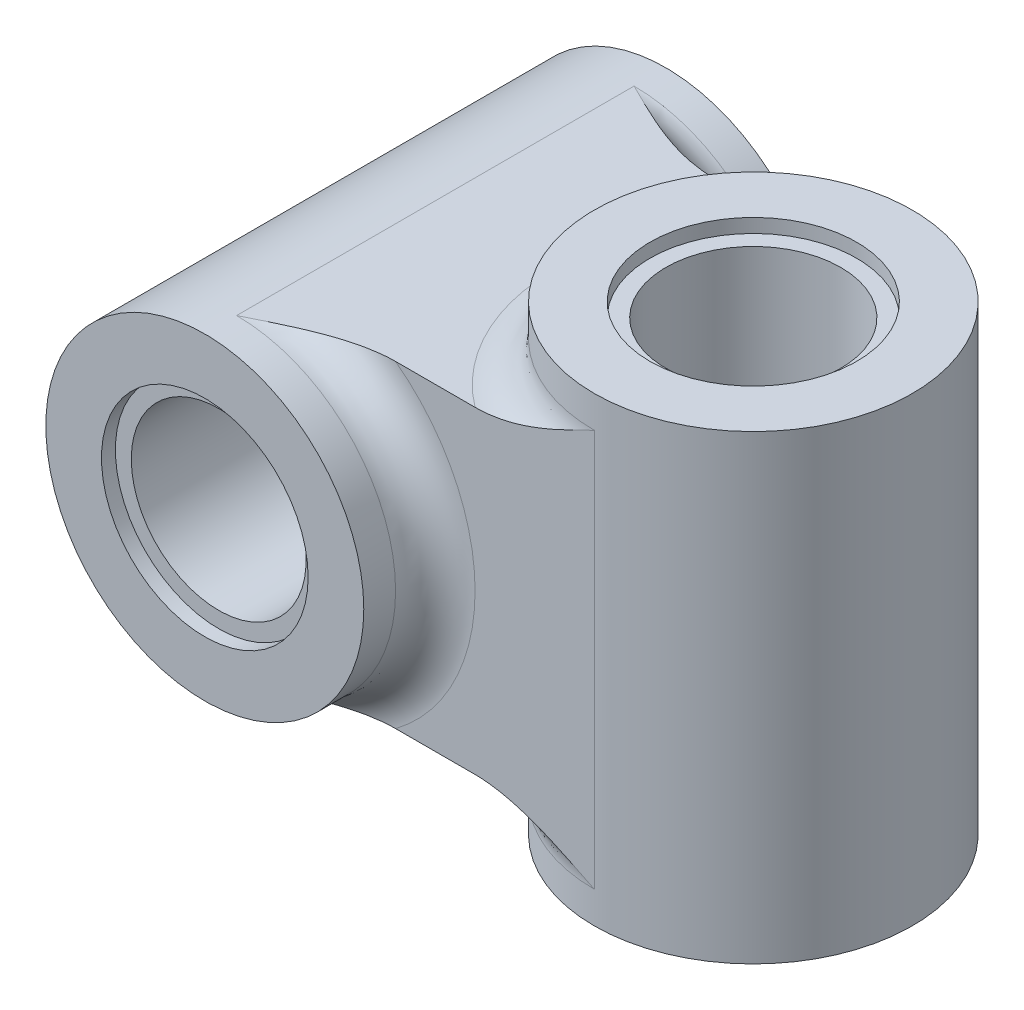
ISO-10303-21;
HEADER;
FILE_DESCRIPTION(('STEP AP214'),'2;1');
FILE_NAME('part.step','',(''),(''),'','','');
FILE_SCHEMA(('AUTOMOTIVE_DESIGN { 1 0 10303 214 1 1 1 1 }'));
ENDSEC;
DATA;
#1=APPLICATION_CONTEXT('core data for automotive mechanical design processes');
#2=APPLICATION_PROTOCOL_DEFINITION('international standard','automotive_design',2000,#1);
#3=PRODUCT_CONTEXT('',#1,'mechanical');
#4=PRODUCT('Part','Part','',(#3));
#5=PRODUCT_RELATED_PRODUCT_CATEGORY('part','',(#4));
#6=PRODUCT_DEFINITION_FORMATION('','',#4);
#7=PRODUCT_DEFINITION_CONTEXT('part definition',#1,'design');
#8=PRODUCT_DEFINITION('design','',#6,#7);
#9=PRODUCT_DEFINITION_SHAPE('','',#8);
#10=(LENGTH_UNIT() NAMED_UNIT(*) SI_UNIT(.MILLI.,.METRE.));
#11=(NAMED_UNIT(*) PLANE_ANGLE_UNIT() SI_UNIT($,.RADIAN.));
#12=(NAMED_UNIT(*) SI_UNIT($,.STERADIAN.) SOLID_ANGLE_UNIT());
#13=UNCERTAINTY_MEASURE_WITH_UNIT(LENGTH_MEASURE(1.E-05),#10,'distance_accuracy_value','');
#14=(GEOMETRIC_REPRESENTATION_CONTEXT(3) GLOBAL_UNCERTAINTY_ASSIGNED_CONTEXT((#13)) GLOBAL_UNIT_ASSIGNED_CONTEXT((#10,
#11,#12)) REPRESENTATION_CONTEXT('',''));
#15=CARTESIAN_POINT('',(0.,0.,0.));
#16=DIRECTION('',(0.,0.,1.));
#17=DIRECTION('',(1.,0.,0.));
#18=AXIS2_PLACEMENT_3D('',#15,#16,#17);
#19=CARTESIAN_POINT('',(40.,29.,29.));
#20=DIRECTION('',(0.,-1.,0.));
#21=DIRECTION('',(0.,0.,-1.));
#22=AXIS2_PLACEMENT_3D('',#19,#20,#21);
#23=CYLINDRICAL_SURFACE('',#22,11.);
#24=CARTESIAN_POINT('',(40.,27.25,29.));
#25=DIRECTION('',(0.,1.,0.));
#26=DIRECTION('',(0.,0.,1.));
#27=AXIS2_PLACEMENT_3D('',#24,#25,#26);
#28=CIRCLE('',#27,11.);
#29=CARTESIAN_POINT('',(40.,27.25,18.));
#30=VERTEX_POINT('',#29);
#31=EDGE_CURVE('E201',#30,#30,#28,.T.);
#32=CARTESIAN_POINT('',(40.,-27.25,29.));
#33=DIRECTION('',(0.,-1.,0.));
#34=DIRECTION('',(0.,0.,-1.));
#35=AXIS2_PLACEMENT_3D('',#32,#33,#34);
#36=CIRCLE('',#35,11.);
#37=CARTESIAN_POINT('',(40.,-27.25,18.));
#38=VERTEX_POINT('',#37);
#39=EDGE_CURVE('E46',#38,#38,#36,.T.);
#40=CARTESIAN_POINT('',(40.,27.25,18.));
#41=CARTESIAN_POINT('',(40.,26.6822916666667,18.));
#42=CARTESIAN_POINT('',(40.,26.1145833333333,18.));
#43=CARTESIAN_POINT('',(40.,24.9791666666667,18.));
#44=CARTESIAN_POINT('',(40.,24.4114583333333,18.));
#45=CARTESIAN_POINT('',(40.,23.2760416666667,18.));
#46=CARTESIAN_POINT('',(40.,22.7083333333333,18.));
#47=CARTESIAN_POINT('',(40.,21.5729166666667,18.));
#48=CARTESIAN_POINT('',(40.,21.0052083333333,18.));
#49=CARTESIAN_POINT('',(40.,19.8697916666667,18.));
#50=CARTESIAN_POINT('',(40.,19.3020833333333,18.));
#51=CARTESIAN_POINT('',(40.,18.1666666666667,18.));
#52=CARTESIAN_POINT('',(40.,17.5989583333333,18.));
#53=CARTESIAN_POINT('',(40.,16.4635416666667,18.));
#54=CARTESIAN_POINT('',(40.,15.8958333333333,18.));
#55=CARTESIAN_POINT('',(40.,14.7604166666667,18.));
#56=CARTESIAN_POINT('',(40.,14.1927083333333,18.));
#57=CARTESIAN_POINT('',(40.,13.0572916666667,18.));
#58=CARTESIAN_POINT('',(40.,12.4895833333333,18.));
#59=CARTESIAN_POINT('',(40.,11.3541666666667,18.));
#60=CARTESIAN_POINT('',(40.,10.7864583333333,18.));
#61=CARTESIAN_POINT('',(40.,9.65104166666667,18.));
#62=CARTESIAN_POINT('',(40.,9.08333333333333,18.));
#63=CARTESIAN_POINT('',(40.,7.94791666666667,18.));
#64=CARTESIAN_POINT('',(40.,7.38020833333333,18.));
#65=CARTESIAN_POINT('',(40.,6.24479166666667,18.));
#66=CARTESIAN_POINT('',(40.,5.67708333333333,18.));
#67=CARTESIAN_POINT('',(40.,4.54166666666667,18.));
#68=CARTESIAN_POINT('',(40.,3.97395833333333,18.));
#69=CARTESIAN_POINT('',(40.,2.83854166666667,18.));
#70=CARTESIAN_POINT('',(40.,2.27083333333333,18.));
#71=CARTESIAN_POINT('',(40.,1.13541666666667,18.));
#72=CARTESIAN_POINT('',(40.,0.567708333333333,18.));
#73=CARTESIAN_POINT('',(40.,-0.567708333333333,18.));
#74=CARTESIAN_POINT('',(40.,-1.13541666666667,18.));
#75=CARTESIAN_POINT('',(40.,-2.27083333333333,18.));
#76=CARTESIAN_POINT('',(40.,-2.83854166666666,18.));
#77=CARTESIAN_POINT('',(40.,-3.97395833333333,18.));
#78=CARTESIAN_POINT('',(40.,-4.54166666666666,18.));
#79=CARTESIAN_POINT('',(40.,-5.67708333333333,18.));
#80=CARTESIAN_POINT('',(40.,-6.24479166666666,18.));
#81=CARTESIAN_POINT('',(40.,-7.38020833333333,18.));
#82=CARTESIAN_POINT('',(40.,-7.94791666666666,18.));
#83=CARTESIAN_POINT('',(40.,-9.08333333333333,18.));
#84=CARTESIAN_POINT('',(40.,-9.65104166666666,18.));
#85=CARTESIAN_POINT('',(40.,-10.7864583333333,18.));
#86=CARTESIAN_POINT('',(40.,-11.3541666666667,18.));
#87=CARTESIAN_POINT('',(40.,-12.4895833333333,18.));
#88=CARTESIAN_POINT('',(40.,-13.0572916666667,18.));
#89=CARTESIAN_POINT('',(40.,-14.1927083333333,18.));
#90=CARTESIAN_POINT('',(40.,-14.7604166666667,18.));
#91=CARTESIAN_POINT('',(40.,-15.8958333333333,18.));
#92=CARTESIAN_POINT('',(40.,-16.4635416666667,18.));
#93=CARTESIAN_POINT('',(40.,-17.5989583333333,18.));
#94=CARTESIAN_POINT('',(40.,-18.1666666666667,18.));
#95=CARTESIAN_POINT('',(40.,-19.3020833333333,18.));
#96=CARTESIAN_POINT('',(40.,-19.8697916666667,18.));
#97=CARTESIAN_POINT('',(40.,-21.0052083333333,18.));
#98=CARTESIAN_POINT('',(40.,-21.5729166666667,18.));
#99=CARTESIAN_POINT('',(40.,-22.7083333333333,18.));
#100=CARTESIAN_POINT('',(40.,-23.2760416666667,18.));
#101=CARTESIAN_POINT('',(40.,-24.4114583333333,18.));
#102=CARTESIAN_POINT('',(40.,-24.9791666666667,18.));
#103=CARTESIAN_POINT('',(40.,-26.1145833333333,18.));
#104=CARTESIAN_POINT('',(40.,-26.6822916666667,18.));
#105=CARTESIAN_POINT('',(40.,-27.25,18.));
#106=B_SPLINE_CURVE_WITH_KNOTS('',3,(#40,#41,#42,#43,#44,#45,#46,#47,#48,#49,#50,#51,#52,#53,
#54,#55,#56,#57,#58,#59,#60,#61,#62,#63,#64,#65,#66,#67,#68,#69,#70,#71,#72,#73,#74,#75,#76,#77,
#78,#79,#80,#81,#82,#83,#84,#85,#86,#87,#88,#89,#90,#91,#92,#93,#94,#95,#96,#97,#98,#99,#100,
#101,#102,#103,#104,#105),.UNSPECIFIED.,.F.,.F.,(4,2,2,2,2,2,2,2,2,2,2,2,2,2,2,2,2,2,2,2,2,2,2,
2,2,2,2,2,2,2,2,2,4),(0.,1.703125,3.40625,5.109375,6.8125,8.515625,10.21875,11.921875,13.625,
15.328125,17.03125,18.734375,20.4375,22.140625,23.84375,25.546875,27.25,28.953125,30.65625,
32.359375,34.0625,35.765625,37.46875,39.171875,40.875,42.578125,44.28125,45.984375,47.6875,
49.390625,51.09375,52.796875,54.5),.UNSPECIFIED.);
#107=EDGE_CURVE('BSEAM41',#30,#38,#106,.T.);
#108=ORIENTED_EDGE('',*,*,#31,.T.);
#109=ORIENTED_EDGE('',*,*,#39,.T.);
#110=ORIENTED_EDGE('',*,*,#107,.T.);
#111=ORIENTED_EDGE('',*,*,#107,.F.);
#112=EDGE_LOOP('',(#108,#110,#109,#111));
#113=FACE_BOUND('',#112,.T.);
#114=ADVANCED_FACE('F41',(#113),#23,.F.);
#115=CARTESIAN_POINT('',(0.,0.,58.));
#116=DIRECTION('',(0.,0.,-1.));
#117=DIRECTION('',(-1.,0.,0.));
#118=AXIS2_PLACEMENT_3D('',#115,#116,#117);
#119=CYLINDRICAL_SURFACE('',#118,11.);
#120=CARTESIAN_POINT('',(0.,0.,1.75));
#121=DIRECTION('',(0.,0.,-1.));
#122=DIRECTION('',(-1.,0.,0.));
#123=AXIS2_PLACEMENT_3D('',#120,#121,#122);
#124=CIRCLE('',#123,11.);
#125=CARTESIAN_POINT('',(-11.,0.,1.75));
#126=VERTEX_POINT('',#125);
#127=EDGE_CURVE('E192',#126,#126,#124,.T.);
#128=CARTESIAN_POINT('',(0.,0.,56.25));
#129=DIRECTION('',(0.,0.,1.));
#130=DIRECTION('',(1.,0.,0.));
#131=AXIS2_PLACEMENT_3D('',#128,#129,#130);
#132=CIRCLE('',#131,11.);
#133=CARTESIAN_POINT('',(-11.,0.,56.25));
#134=VERTEX_POINT('',#133);
#135=EDGE_CURVE('E197',#134,#134,#132,.T.);
#136=CARTESIAN_POINT('',(-11.,0.,1.75));
#137=CARTESIAN_POINT('',(-11.,0.,2.31770833333334));
#138=CARTESIAN_POINT('',(-11.,0.,2.88541666666667));
#139=CARTESIAN_POINT('',(-11.,0.,4.02083333333333));
#140=CARTESIAN_POINT('',(-11.,0.,4.58854166666667));
#141=CARTESIAN_POINT('',(-11.,0.,5.72395833333333));
#142=CARTESIAN_POINT('',(-11.,0.,6.29166666666667));
#143=CARTESIAN_POINT('',(-11.,0.,7.42708333333333));
#144=CARTESIAN_POINT('',(-11.,0.,7.99479166666667));
#145=CARTESIAN_POINT('',(-11.,0.,9.13020833333333));
#146=CARTESIAN_POINT('',(-11.,0.,9.69791666666667));
#147=CARTESIAN_POINT('',(-11.,0.,10.8333333333333));
#148=CARTESIAN_POINT('',(-11.,0.,11.4010416666667));
#149=CARTESIAN_POINT('',(-11.,0.,12.5364583333333));
#150=CARTESIAN_POINT('',(-11.,0.,13.1041666666667));
#151=CARTESIAN_POINT('',(-11.,0.,14.2395833333333));
#152=CARTESIAN_POINT('',(-11.,0.,14.8072916666667));
#153=CARTESIAN_POINT('',(-11.,0.,15.9427083333333));
#154=CARTESIAN_POINT('',(-11.,0.,16.5104166666667));
#155=CARTESIAN_POINT('',(-11.,0.,17.6458333333333));
#156=CARTESIAN_POINT('',(-11.,0.,18.2135416666667));
#157=CARTESIAN_POINT('',(-11.,0.,19.3489583333333));
#158=CARTESIAN_POINT('',(-11.,0.,19.9166666666667));
#159=CARTESIAN_POINT('',(-11.,0.,21.0520833333333));
#160=CARTESIAN_POINT('',(-11.,0.,21.6197916666667));
#161=CARTESIAN_POINT('',(-11.,0.,22.7552083333333));
#162=CARTESIAN_POINT('',(-11.,0.,23.3229166666667));
#163=CARTESIAN_POINT('',(-11.,0.,24.4583333333333));
#164=CARTESIAN_POINT('',(-11.,0.,25.0260416666667));
#165=CARTESIAN_POINT('',(-11.,0.,26.1614583333333));
#166=CARTESIAN_POINT('',(-11.,0.,26.7291666666667));
#167=CARTESIAN_POINT('',(-11.,0.,27.8645833333333));
#168=CARTESIAN_POINT('',(-11.,0.,28.4322916666667));
#169=CARTESIAN_POINT('',(-11.,0.,29.5677083333333));
#170=CARTESIAN_POINT('',(-11.,0.,30.1354166666667));
#171=CARTESIAN_POINT('',(-11.,0.,31.2708333333333));
#172=CARTESIAN_POINT('',(-11.,0.,31.8385416666667));
#173=CARTESIAN_POINT('',(-11.,0.,32.9739583333333));
#174=CARTESIAN_POINT('',(-11.,0.,33.5416666666667));
#175=CARTESIAN_POINT('',(-11.,0.,34.6770833333333));
#176=CARTESIAN_POINT('',(-11.,0.,35.2447916666667));
#177=CARTESIAN_POINT('',(-11.,0.,36.3802083333333));
#178=CARTESIAN_POINT('',(-11.,0.,36.9479166666667));
#179=CARTESIAN_POINT('',(-11.,0.,38.0833333333333));
#180=CARTESIAN_POINT('',(-11.,0.,38.6510416666667));
#181=CARTESIAN_POINT('',(-11.,0.,39.7864583333333));
#182=CARTESIAN_POINT('',(-11.,0.,40.3541666666667));
#183=CARTESIAN_POINT('',(-11.,0.,41.4895833333333));
#184=CARTESIAN_POINT('',(-11.,0.,42.0572916666667));
#185=CARTESIAN_POINT('',(-11.,0.,43.1927083333333));
#186=CARTESIAN_POINT('',(-11.,0.,43.7604166666667));
#187=CARTESIAN_POINT('',(-11.,0.,44.8958333333333));
#188=CARTESIAN_POINT('',(-11.,0.,45.4635416666667));
#189=CARTESIAN_POINT('',(-11.,0.,46.5989583333333));
#190=CARTESIAN_POINT('',(-11.,0.,47.1666666666667));
#191=CARTESIAN_POINT('',(-11.,0.,48.3020833333333));
#192=CARTESIAN_POINT('',(-11.,0.,48.8697916666667));
#193=CARTESIAN_POINT('',(-11.,0.,50.0052083333333));
#194=CARTESIAN_POINT('',(-11.,0.,50.5729166666667));
#195=CARTESIAN_POINT('',(-11.,0.,51.7083333333333));
#196=CARTESIAN_POINT('',(-11.,0.,52.2760416666667));
#197=CARTESIAN_POINT('',(-11.,0.,53.4114583333333));
#198=CARTESIAN_POINT('',(-11.,0.,53.9791666666667));
#199=CARTESIAN_POINT('',(-11.,0.,55.1145833333333));
#200=CARTESIAN_POINT('',(-11.,0.,55.6822916666667));
#201=CARTESIAN_POINT('',(-11.,0.,56.25));
#202=B_SPLINE_CURVE_WITH_KNOTS('',3,(#136,#137,#138,#139,#140,#141,#142,#143,#144,#145,#146,
#147,#148,#149,#150,#151,#152,#153,#154,#155,#156,#157,#158,#159,#160,#161,#162,#163,#164,#165,
#166,#167,#168,#169,#170,#171,#172,#173,#174,#175,#176,#177,#178,#179,#180,#181,#182,#183,#184,
#185,#186,#187,#188,#189,#190,#191,#192,#193,#194,#195,#196,#197,#198,#199,#200,#201),
.UNSPECIFIED.,.F.,.F.,(4,2,2,2,2,2,2,2,2,2,2,2,2,2,2,2,2,2,2,2,2,2,2,2,2,2,2,2,2,2,2,2,4),(0.,
1.703125,3.40625,5.109375,6.8125,8.515625,10.21875,11.921875,13.625,15.328125,17.03125,
18.734375,20.4375,22.140625,23.84375,25.546875,27.25,28.953125,30.65625,32.359375,34.0625,
35.765625,37.46875,39.171875,40.875,42.578125,44.28125,45.984375,47.6875,49.390625,51.09375,
52.796875,54.5),.UNSPECIFIED.);
#203=EDGE_CURVE('BSEAM298',#126,#134,#202,.T.);
#204=ORIENTED_EDGE('',*,*,#127,.T.);
#205=ORIENTED_EDGE('',*,*,#135,.T.);
#206=ORIENTED_EDGE('',*,*,#203,.T.);
#207=ORIENTED_EDGE('',*,*,#203,.F.);
#208=EDGE_LOOP('',(#204,#206,#205,#207));
#209=FACE_BOUND('',#208,.T.);
#210=ADVANCED_FACE('F298',(#209),#119,.F.);
#211=CARTESIAN_POINT('',(0.,0.,58.));
#212=DIRECTION('',(0.,0.,1.));
#213=DIRECTION('',(1.,0.,0.));
#214=AXIS2_PLACEMENT_3D('',#211,#212,#213);
#215=PLANE('',#214);
#216=CARTESIAN_POINT('',(0.,0.,58.));
#217=DIRECTION('',(0.,0.,1.));
#218=DIRECTION('',(1.,0.,0.));
#219=AXIS2_PLACEMENT_3D('',#216,#217,#218);
#220=CIRCLE('',#219,13.);
#221=CARTESIAN_POINT('',(13.,0.,58.));
#222=VERTEX_POINT('',#221);
#223=EDGE_CURVE('E203',#222,#222,#220,.T.);
#224=ORIENTED_EDGE('',*,*,#223,.F.);
#225=EDGE_LOOP('',(#224));
#226=FACE_BOUND('',#225,.T.);
#227=CARTESIAN_POINT('',(0.,0.,58.));
#228=DIRECTION('',(0.,0.,1.));
#229=DIRECTION('',(1.,0.,0.));
#230=AXIS2_PLACEMENT_3D('',#227,#228,#229);
#231=CIRCLE('',#230,20.);
#232=CARTESIAN_POINT('',(20.,0.,58.));
#233=VERTEX_POINT('',#232);
#234=EDGE_CURVE('E124',#233,#233,#231,.T.);
#235=ORIENTED_EDGE('',*,*,#234,.T.);
#236=EDGE_LOOP('',(#235));
#237=FACE_BOUND('',#236,.T.);
#238=ADVANCED_FACE('F303',(#226,#237),#215,.T.);
#239=CARTESIAN_POINT('',(0.,0.,0.));
#240=DIRECTION('',(0.,0.,1.));
#241=DIRECTION('',(1.,0.,0.));
#242=AXIS2_PLACEMENT_3D('',#239,#240,#241);
#243=PLANE('',#242);
#244=CARTESIAN_POINT('',(0.,0.,0.));
#245=DIRECTION('',(0.,0.,-1.));
#246=DIRECTION('',(-1.,0.,0.));
#247=AXIS2_PLACEMENT_3D('',#244,#245,#246);
#248=CIRCLE('',#247,13.);
#249=CARTESIAN_POINT('',(-13.,0.,0.));
#250=VERTEX_POINT('',#249);
#251=EDGE_CURVE('E199',#250,#250,#248,.T.);
#252=ORIENTED_EDGE('',*,*,#251,.F.);
#253=EDGE_LOOP('',(#252));
#254=FACE_BOUND('',#253,.T.);
#255=CARTESIAN_POINT('',(0.,0.,0.));
#256=DIRECTION('',(0.,0.,1.));
#257=DIRECTION('',(1.,0.,0.));
#258=AXIS2_PLACEMENT_3D('',#255,#256,#257);
#259=CIRCLE('',#258,20.);
#260=CARTESIAN_POINT('',(20.,0.,0.));
#261=VERTEX_POINT('',#260);
#262=EDGE_CURVE('E239',#261,#261,#259,.T.);
#263=ORIENTED_EDGE('',*,*,#262,.F.);
#264=EDGE_LOOP('',(#263));
#265=FACE_BOUND('',#264,.T.);
#266=ADVANCED_FACE('F418',(#254,#265),#243,.F.);
#267=CARTESIAN_POINT('',(0.,0.,58.));
#268=DIRECTION('',(0.,0.,-1.));
#269=DIRECTION('',(-1.,0.,0.));
#270=AXIS2_PLACEMENT_3D('',#267,#268,#269);
#271=CYLINDRICAL_SURFACE('',#270,20.);
#272=DIRECTION('',(0.,0.,-1.));
#273=VECTOR('',#272,1.);
#274=CARTESIAN_POINT('',(0.,20.,49.));
#275=LINE('',#274,#273);
#276=CARTESIAN_POINT('',(0.,20.,54.));
#277=VERTEX_POINT('',#276);
#278=CARTESIAN_POINT('',(0.,20.,3.99999999999999));
#279=VERTEX_POINT('',#278);
#280=EDGE_CURVE('E229',#277,#279,#275,.T.);
#281=ORIENTED_EDGE('',*,*,#280,.T.);
#282=CARTESIAN_POINT('',(0.,0.,3.99999999999998));
#283=DIRECTION('',(0.,0.,1.));
#284=DIRECTION('',(0.,-1.,0.));
#285=AXIS2_PLACEMENT_3D('',#282,#283,#284);
#286=CIRCLE('',#285,20.);
#287=CARTESIAN_POINT('',(0.,-20.,3.99999999999998));
#288=VERTEX_POINT('',#287);
#289=EDGE_CURVE('E260',#279,#288,#286,.F.);
#290=ORIENTED_EDGE('',*,*,#289,.T.);
#291=DIRECTION('',(0.,0.,-1.));
#292=VECTOR('',#291,1.);
#293=CARTESIAN_POINT('',(0.,-20.,49.));
#294=LINE('',#293,#292);
#295=CARTESIAN_POINT('',(0.,-20.,54.));
#296=VERTEX_POINT('',#295);
#297=EDGE_CURVE('E116',#296,#288,#294,.T.);
#298=ORIENTED_EDGE('',*,*,#297,.F.);
#299=CARTESIAN_POINT('',(0.,0.,54.));
#300=DIRECTION('',(0.,0.,1.));
#301=DIRECTION('',(1.,0.,0.));
#302=AXIS2_PLACEMENT_3D('',#299,#300,#301);
#303=CIRCLE('',#302,20.);
#304=EDGE_CURVE('E257',#296,#277,#303,.T.);
#305=ORIENTED_EDGE('',*,*,#304,.T.);
#306=EDGE_LOOP('',(#281,#290,#298,#305));
#307=FACE_BOUND('',#306,.T.);
#308=ORIENTED_EDGE('',*,*,#234,.F.);
#309=EDGE_LOOP('',(#308));
#310=FACE_BOUND('',#309,.T.);
#311=ORIENTED_EDGE('',*,*,#262,.T.);
#312=EDGE_LOOP('',(#311));
#313=FACE_BOUND('',#312,.T.);
#314=ADVANCED_FACE('F282',(#307,#310,#313),#271,.T.);
#315=CARTESIAN_POINT('',(40.,-20.,49.));
#316=DIRECTION('',(0.,0.,1.));
#317=DIRECTION('',(1.,0.,0.));
#318=AXIS2_PLACEMENT_3D('',#315,#316,#317);
#319=PLANE('',#318);
#320=DIRECTION('',(-1.,0.,0.));
#321=VECTOR('',#320,1.);
#322=CARTESIAN_POINT('',(40.,20.,49.));
#323=LINE('',#322,#321);
#324=CARTESIAN_POINT('',(25.,20.,49.));
#325=VERTEX_POINT('',#324);
#326=CARTESIAN_POINT('',(15.,20.,49.));
#327=VERTEX_POINT('',#326);
#328=EDGE_CURVE('E233',#325,#327,#323,.T.);
#329=ORIENTED_EDGE('',*,*,#328,.T.);
#330=CARTESIAN_POINT('',(0.,0.,49.));
#331=DIRECTION('',(0.,0.,1.));
#332=DIRECTION('',(1.,0.,0.));
#333=AXIS2_PLACEMENT_3D('',#330,#331,#332);
#334=CIRCLE('',#333,25.);
#335=CARTESIAN_POINT('',(15.,-20.,49.));
#336=VERTEX_POINT('',#335);
#337=EDGE_CURVE('E264',#327,#336,#334,.F.);
#338=ORIENTED_EDGE('',*,*,#337,.T.);
#339=DIRECTION('',(-1.,0.,0.));
#340=VECTOR('',#339,1.);
#341=CARTESIAN_POINT('',(40.,-20.,49.));
#342=LINE('',#341,#340);
#343=CARTESIAN_POINT('',(25.,-20.,49.));
#344=VERTEX_POINT('',#343);
#345=EDGE_CURVE('E236',#344,#336,#342,.T.);
#346=ORIENTED_EDGE('',*,*,#345,.F.);
#347=CARTESIAN_POINT('',(25.,-20.,49.));
#348=CARTESIAN_POINT('',(25.2651282089429,-20.0000248440085,49.));
#349=CARTESIAN_POINT('',(25.5301771044987,-20.007589934337,49.));
#350=CARTESIAN_POINT('',(26.0593880846254,-20.0364294351582,49.));
#351=CARTESIAN_POINT('',(26.3235505882963,-20.0576960351639,49.));
#352=CARTESIAN_POINT('',(26.8497890843893,-20.1124898408836,49.));
#353=CARTESIAN_POINT('',(27.1118689280912,-20.145980810748,49.));
#354=CARTESIAN_POINT('',(27.6343923106904,-20.2240499150372,49.));
#355=CARTESIAN_POINT('',(27.8948355873029,-20.2686297823921,49.));
#356=CARTESIAN_POINT('',(28.6664609884388,-20.4160433975464,49.));
#357=CARTESIAN_POINT('',(29.1749087512093,-20.5333381947335,49.));
#358=CARTESIAN_POINT('',(30.1837126611257,-20.7995778005164,49.));
#359=CARTESIAN_POINT('',(30.6840614597819,-20.9485497892506,49.));
#360=CARTESIAN_POINT('',(31.5605831445864,-21.2342047748402,49.));
#361=CARTESIAN_POINT('',(31.9384874405667,-21.3656435859749,49.));
#362=CARTESIAN_POINT('',(32.6897037488905,-21.6410837307938,49.));
#363=CARTESIAN_POINT('',(33.0630153714214,-21.7850861225578,49.));
#364=CARTESIAN_POINT('',(34.176661641421,-22.2325984737774,49.));
#365=CARTESIAN_POINT('',(34.9107431272673,-22.5516256043198,49.));
#366=CARTESIAN_POINT('',(36.3696325965115,-23.216950662706,49.));
#367=CARTESIAN_POINT('',(37.0943930587858,-23.5633504064254,49.));
#368=CARTESIAN_POINT('',(38.5376845637521,-24.2689287241272,49.));
#369=CARTESIAN_POINT('',(39.2562150092713,-24.6281085066499,49.));
#370=CARTESIAN_POINT('',(39.9831345201157,-24.9915672610964,49.));
#371=CARTESIAN_POINT('',(39.9915672605557,-24.9957836313378,49.));
#372=CARTESIAN_POINT('',(40.,-25.,49.));
#373=B_SPLINE_CURVE_WITH_KNOTS('',3,(#347,#348,#349,#350,#351,#352,#353,#354,#355,#356,#357,
#358,#359,#360,#361,#362,#363,#364,#365,#366,#367,#368,#369,#370,#371,#372),.UNSPECIFIED.,.F.,
.F.,(4,2,2,2,2,2,2,2,2,2,2,2,4),(0.,0.795162748327174,1.58987261810577,2.38224566558403,
3.17474261995516,4.73875375654246,6.30411232391702,7.50419539676254,8.70437963595933,
11.1046360659497,13.5142837354925,15.9241598813816,15.952444152629),.UNSPECIFIED.);
#374=CARTESIAN_POINT('',(40.,-25.,49.));
#375=VERTEX_POINT('',#374);
#376=EDGE_CURVE('E111',#344,#375,#373,.T.);
#377=ORIENTED_EDGE('',*,*,#376,.T.);
#378=DIRECTION('',(0.,1.,0.));
#379=VECTOR('',#378,1.);
#380=CARTESIAN_POINT('',(40.,-20.,49.));
#381=LINE('',#380,#379);
#382=CARTESIAN_POINT('',(40.,25.,49.));
#383=VERTEX_POINT('',#382);
#384=EDGE_CURVE('E106',#375,#383,#381,.T.);
#385=ORIENTED_EDGE('',*,*,#384,.T.);
#386=CARTESIAN_POINT('',(25.,20.,49.));
#387=CARTESIAN_POINT('',(25.2651282089429,20.0000248440085,49.));
#388=CARTESIAN_POINT('',(25.5301771044987,20.007589934337,49.));
#389=CARTESIAN_POINT('',(26.0593880846254,20.0364294351582,49.));
#390=CARTESIAN_POINT('',(26.3235505882963,20.0576960351639,49.));
#391=CARTESIAN_POINT('',(26.8497890843893,20.1124898408836,49.));
#392=CARTESIAN_POINT('',(27.1118689280912,20.145980810748,49.));
#393=CARTESIAN_POINT('',(27.6343923106904,20.2240499150372,49.));
#394=CARTESIAN_POINT('',(27.8948355873029,20.2686297823921,49.));
#395=CARTESIAN_POINT('',(28.6664609884388,20.4160433975464,49.));
#396=CARTESIAN_POINT('',(29.1749087512093,20.5333381947335,49.));
#397=CARTESIAN_POINT('',(30.1837126611257,20.7995778005164,49.));
#398=CARTESIAN_POINT('',(30.6840614597819,20.9485497892506,49.));
#399=CARTESIAN_POINT('',(31.5605831445864,21.2342047748402,49.));
#400=CARTESIAN_POINT('',(31.9384874405667,21.3656435859748,49.));
#401=CARTESIAN_POINT('',(32.6897037488905,21.6410837307938,49.));
#402=CARTESIAN_POINT('',(33.0630153714214,21.7850861225578,49.));
#403=CARTESIAN_POINT('',(34.176661641421,22.2325984737774,49.));
#404=CARTESIAN_POINT('',(34.9107431272673,22.5516256043198,49.));
#405=CARTESIAN_POINT('',(36.3696325965115,23.216950662706,49.));
#406=CARTESIAN_POINT('',(37.0943930587858,23.5633504064254,49.));
#407=CARTESIAN_POINT('',(38.5376845637521,24.2689287241272,49.));
#408=CARTESIAN_POINT('',(39.2562150092713,24.6281085066499,49.));
#409=CARTESIAN_POINT('',(39.9831345201157,24.9915672610964,49.));
#410=CARTESIAN_POINT('',(39.9915672605557,24.9957836313378,49.));
#411=CARTESIAN_POINT('',(40.,25.,49.));
#412=B_SPLINE_CURVE_WITH_KNOTS('',3,(#386,#387,#388,#389,#390,#391,#392,#393,#394,#395,#396,
#397,#398,#399,#400,#401,#402,#403,#404,#405,#406,#407,#408,#409,#410,#411),.UNSPECIFIED.,.F.,
.F.,(4,2,2,2,2,2,2,2,2,2,2,2,4),(0.,0.795162748327174,1.58987261810577,2.38224566558403,
3.17474261995516,4.73875375654246,6.30411232391702,7.50419539676255,8.70437963595933,
11.1046360659497,13.5142837354925,15.9241598813816,15.952444152629),.UNSPECIFIED.);
#413=EDGE_CURVE('E65',#383,#325,#412,.F.);
#414=ORIENTED_EDGE('',*,*,#413,.T.);
#415=EDGE_LOOP('',(#329,#338,#346,#377,#385,#414));
#416=FACE_BOUND('',#415,.T.);
#417=ADVANCED_FACE('F108',(#416),#319,.T.);
#418=CARTESIAN_POINT('',(40.,-20.,49.));
#419=DIRECTION('',(0.,1.,0.));
#420=DIRECTION('',(0.,0.,1.));
#421=AXIS2_PLACEMENT_3D('',#418,#419,#420);
#422=PLANE('',#421);
#423=DIRECTION('',(-1.,0.,0.));
#424=VECTOR('',#423,1.);
#425=CARTESIAN_POINT('',(40.,-20.,8.99999999999998));
#426=LINE('',#425,#424);
#427=CARTESIAN_POINT('',(25.,-20.,8.99999999999998));
#428=VERTEX_POINT('',#427);
#429=CARTESIAN_POINT('',(15.,-20.,8.99999999999998));
#430=VERTEX_POINT('',#429);
#431=EDGE_CURVE('E240',#428,#430,#426,.T.);
#432=ORIENTED_EDGE('',*,*,#431,.F.);
#433=CARTESIAN_POINT('',(40.,-20.,29.));
#434=DIRECTION('',(0.,1.,0.));
#435=DIRECTION('',(0.,0.,1.));
#436=AXIS2_PLACEMENT_3D('',#433,#434,#435);
#437=CIRCLE('',#436,25.);
#438=EDGE_CURVE('E252',#428,#344,#437,.T.);
#439=ORIENTED_EDGE('',*,*,#438,.T.);
#440=ORIENTED_EDGE('',*,*,#345,.T.);
#441=CARTESIAN_POINT('',(15.,-20.,49.));
#442=CARTESIAN_POINT('',(14.734871791058,-20.,49.0000248440085));
#443=CARTESIAN_POINT('',(14.4698228955031,-20.,49.007589934337));
#444=CARTESIAN_POINT('',(13.9406119153781,-20.,49.036429435158));
#445=CARTESIAN_POINT('',(13.6764494117081,-20.,49.0576960351635));
#446=CARTESIAN_POINT('',(13.1502109156166,-20.,49.1124898408829));
#447=CARTESIAN_POINT('',(12.8881310719155,-20.,49.1459808107472));
#448=CARTESIAN_POINT('',(12.3656076893176,-20.,49.2240499150359));
#449=CARTESIAN_POINT('',(12.1051644127057,-20.,49.2686297823906));
#450=CARTESIAN_POINT('',(11.3335390115688,-20.,49.4160433975447));
#451=CARTESIAN_POINT('',(10.8250912487966,-20.,49.533338194732));
#452=CARTESIAN_POINT('',(9.81628733887715,-20.,49.7995778005156));
#453=CARTESIAN_POINT('',(9.31593854021946,-20.,49.9485497892502));
#454=CARTESIAN_POINT('',(8.43941685541347,-20.,50.2342047748402));
#455=CARTESIAN_POINT('',(8.06151255943296,-20.,50.3656435859749));
#456=CARTESIAN_POINT('',(7.31029625110899,-20.,50.641083730794));
#457=CARTESIAN_POINT('',(6.9369846285781,-20.,50.7850861225583));
#458=CARTESIAN_POINT('',(5.82333835857747,-20.,51.2325984737775));
#459=CARTESIAN_POINT('',(5.08925687272968,-20.,51.5516256043185));
#460=CARTESIAN_POINT('',(3.63036740348735,-20.,52.2169506627092));
#461=CARTESIAN_POINT('',(2.90560694121646,-20.,52.5633504064345));
#462=CARTESIAN_POINT('',(1.46231543624279,-20.,53.2689287241194));
#463=CARTESIAN_POINT('',(0.74378499071274,-20.,53.6281085066193));
#464=CARTESIAN_POINT('',(0.0168654798839559,-20.,53.9915672610957));
#465=CARTESIAN_POINT('',(0.00843273944410271,-20.,53.9957836313375));
#466=CARTESIAN_POINT('',(0.,-20.,54.));
#467=B_SPLINE_CURVE_WITH_KNOTS('',3,(#441,#442,#443,#444,#445,#446,#447,#448,#449,#450,#451,
#452,#453,#454,#455,#456,#457,#458,#459,#460,#461,#462,#463,#464,#465,#466),.UNSPECIFIED.,.F.,
.F.,(4,2,2,2,2,2,2,2,2,2,2,2,4),(0.,0.795162748324529,1.58987261810048,2.38224566557666,
3.17474261994572,4.73875375653805,6.30411232391702,7.50419539676299,8.70437963596004,
11.1046360659524,13.5142837354942,15.9241598813816,15.952444152629),.UNSPECIFIED.);
#468=EDGE_CURVE('E12',#336,#296,#467,.T.);
#469=ORIENTED_EDGE('',*,*,#468,.T.);
#470=ORIENTED_EDGE('',*,*,#297,.T.);
#471=CARTESIAN_POINT('',(15.,-20.,8.99999999999998));
#472=CARTESIAN_POINT('',(14.7348717910581,-20.,8.99997515599151));
#473=CARTESIAN_POINT('',(14.4698228955031,-20.,8.99241006566299));
#474=CARTESIAN_POINT('',(13.9406119153783,-20.,8.96357056484199));
#475=CARTESIAN_POINT('',(13.6764494117083,-20.,8.94230396483651));
#476=CARTESIAN_POINT('',(13.1502109156169,-20.,8.88751015911715));
#477=CARTESIAN_POINT('',(12.8881310719158,-20.,8.85401918925287));
#478=CARTESIAN_POINT('',(12.3656076893179,-20.,8.77595008496414));
#479=CARTESIAN_POINT('',(12.1051644127061,-20.,8.73137021760948));
#480=CARTESIAN_POINT('',(11.3335390115692,-20.,8.58395660245538));
#481=CARTESIAN_POINT('',(10.8250912487969,-20.,8.46666180526804));
#482=CARTESIAN_POINT('',(9.81628733887729,-20.,8.20042219948441));
#483=CARTESIAN_POINT('',(9.31593854021953,-20.,8.0514502107498));
#484=CARTESIAN_POINT('',(8.43941685541347,-20.,7.76579522515975));
#485=CARTESIAN_POINT('',(8.06151255943294,-20.,7.63435641402509));
#486=CARTESIAN_POINT('',(7.31029625110897,-20.,7.35891626920594));
#487=CARTESIAN_POINT('',(6.93698462857808,-20.,7.2149138774417));
#488=CARTESIAN_POINT('',(5.8233383585774,-20.,6.76740152622248));
#489=CARTESIAN_POINT('',(5.08925687272954,-20.,6.4483743956816));
#490=CARTESIAN_POINT('',(3.6303674034873,-20.,5.78304933729061));
#491=CARTESIAN_POINT('',(2.90560694121658,-20.,5.43664959356502));
#492=CARTESIAN_POINT('',(1.46231543624254,-20.,4.73107127588095));
#493=CARTESIAN_POINT('',(0.743784990711952,-20.,4.37189149338223));
#494=CARTESIAN_POINT('',(0.016865479883942,-20.,4.00843273890429));
#495=CARTESIAN_POINT('',(0.00843273944409571,-20.,4.00421636866253));
#496=CARTESIAN_POINT('',(0.,-20.,3.99999999999998));
#497=B_SPLINE_CURVE_WITH_KNOTS('',3,(#471,#472,#473,#474,#475,#476,#477,#478,#479,#480,#481,
#482,#483,#484,#485,#486,#487,#488,#489,#490,#491,#492,#493,#494,#495,#496),.UNSPECIFIED.,.F.,
.F.,(4,2,2,2,2,2,2,2,2,2,2,2,4),(0.,0.795162748324397,1.58987261810021,2.3822456655763,
3.17474261994525,4.73875375653783,6.30411232391702,7.50419539676301,8.70437963596008,
11.1046360659526,13.5142837354943,15.9241598813816,15.952444152629),.UNSPECIFIED.);
#498=EDGE_CURVE('E133',#288,#430,#497,.F.);
#499=ORIENTED_EDGE('',*,*,#498,.T.);
#500=EDGE_LOOP('',(#432,#439,#440,#469,#470,#499));
#501=FACE_BOUND('',#500,.T.);
#502=ADVANCED_FACE('F178',(#501),#422,.F.);
#503=CARTESIAN_POINT('',(40.,-20.,8.99999999999998));
#504=DIRECTION('',(0.,0.,1.));
#505=DIRECTION('',(0.,-1.,0.));
#506=AXIS2_PLACEMENT_3D('',#503,#504,#505);
#507=PLANE('',#506);
#508=ORIENTED_EDGE('',*,*,#431,.T.);
#509=CARTESIAN_POINT('',(0.,0.,8.99999999999998));
#510=DIRECTION('',(0.,0.,1.));
#511=DIRECTION('',(0.,-1.,0.));
#512=AXIS2_PLACEMENT_3D('',#509,#510,#511);
#513=CIRCLE('',#512,25.);
#514=CARTESIAN_POINT('',(15.,20.,8.99999999999998));
#515=VERTEX_POINT('',#514);
#516=EDGE_CURVE('E254',#430,#515,#513,.T.);
#517=ORIENTED_EDGE('',*,*,#516,.T.);
#518=DIRECTION('',(-1.,0.,0.));
#519=VECTOR('',#518,1.);
#520=CARTESIAN_POINT('',(40.,20.,8.99999999999998));
#521=LINE('',#520,#519);
#522=CARTESIAN_POINT('',(25.,20.,8.99999999999998));
#523=VERTEX_POINT('',#522);
#524=EDGE_CURVE('E243',#523,#515,#521,.T.);
#525=ORIENTED_EDGE('',*,*,#524,.F.);
#526=CARTESIAN_POINT('',(25.,20.,8.99999999999998));
#527=CARTESIAN_POINT('',(25.265128208942,20.0000248440085,8.99999999999998));
#528=CARTESIAN_POINT('',(25.5301771044969,20.007589934337,8.99999999999998));
#529=CARTESIAN_POINT('',(26.0593880846219,20.036429435158,8.99999999999998));
#530=CARTESIAN_POINT('',(26.3235505882919,20.0576960351635,8.99999999999998));
#531=CARTESIAN_POINT('',(26.8497890843833,20.1124898408829,8.99999999999998));
#532=CARTESIAN_POINT('',(27.1118689280845,20.1459808107471,8.99999999999998));
#533=CARTESIAN_POINT('',(27.6343923106824,20.2240499150359,8.99999999999998));
#534=CARTESIAN_POINT('',(27.8948355872942,20.2686297823906,8.99999999999998));
#535=CARTESIAN_POINT('',(28.6664609884311,20.4160433975447,8.99999999999998));
#536=CARTESIAN_POINT('',(29.1749087512034,20.533338194732,8.99999999999998));
#537=CARTESIAN_POINT('',(30.1837126611228,20.7995778005156,8.99999999999998));
#538=CARTESIAN_POINT('',(30.6840614597805,20.9485497892502,8.99999999999998));
#539=CARTESIAN_POINT('',(31.5605831445865,21.2342047748402,8.99999999999998));
#540=CARTESIAN_POINT('',(31.9384874405671,21.3656435859749,8.99999999999998));
#541=CARTESIAN_POINT('',(32.689703748891,21.641083730794,8.99999999999998));
#542=CARTESIAN_POINT('',(33.0630153714219,21.7850861225583,8.99999999999998));
#543=CARTESIAN_POINT('',(34.1766616414226,22.2325984737775,8.99999999999998));
#544=CARTESIAN_POINT('',(34.9107431272704,22.5516256043184,8.99999999999998));
#545=CARTESIAN_POINT('',(36.3696325965127,23.2169506627093,8.99999999999998));
#546=CARTESIAN_POINT('',(37.0943930587835,23.5633504064346,8.99999999999998));
#547=CARTESIAN_POINT('',(38.5376845637573,24.2689287241193,8.99999999999998));
#548=CARTESIAN_POINT('',(39.2562150092874,24.6281085066189,8.99999999999998));
#549=CARTESIAN_POINT('',(39.983134520116,24.9915672610957,8.99999999999998));
#550=CARTESIAN_POINT('',(39.9915672605559,24.9957836313375,8.99999999999998));
#551=CARTESIAN_POINT('',(40.,25.,8.99999999999998));
#552=B_SPLINE_CURVE_WITH_KNOTS('',3,(#526,#527,#528,#529,#530,#531,#532,#533,#534,#535,#536,
#537,#538,#539,#540,#541,#542,#543,#544,#545,#546,#547,#548,#549,#550,#551),.UNSPECIFIED.,.F.,
.F.,(4,2,2,2,2,2,2,2,2,2,2,2,4),(0.,0.795162748324496,1.58987261810041,2.38224566557658,
3.17474261994561,4.738753756538,6.30411232391703,7.50419539676301,8.70437963596006,
11.1046360659525,13.5142837354942,15.9241598813816,15.952444152629),.UNSPECIFIED.);
#553=CARTESIAN_POINT('',(40.,25.,8.99999999999998));
#554=VERTEX_POINT('',#553);
#555=EDGE_CURVE('E130',#523,#554,#552,.T.);
#556=ORIENTED_EDGE('',*,*,#555,.T.);
#557=DIRECTION('',(0.,1.,0.));
#558=VECTOR('',#557,1.);
#559=CARTESIAN_POINT('',(40.,-20.,8.99999999999998));
#560=LINE('',#559,#558);
#561=CARTESIAN_POINT('',(40.,-25.,8.99999999999998));
#562=VERTEX_POINT('',#561);
#563=EDGE_CURVE('E115',#562,#554,#560,.T.);
#564=ORIENTED_EDGE('',*,*,#563,.F.);
#565=CARTESIAN_POINT('',(25.,-20.,8.99999999999998));
#566=CARTESIAN_POINT('',(25.2651282089405,-20.0000248440085,8.99999999999998));
#567=CARTESIAN_POINT('',(25.5301771044939,-20.0075899343369,8.99999999999998));
#568=CARTESIAN_POINT('',(26.0593880846159,-20.0364294351576,8.99999999999998));
#569=CARTESIAN_POINT('',(26.3235505882844,-20.0576960351628,8.99999999999998));
#570=CARTESIAN_POINT('',(26.8497890843731,-20.1124898408817,8.99999999999998));
#571=CARTESIAN_POINT('',(27.1118689280732,-20.1459808107456,8.99999999999998));
#572=CARTESIAN_POINT('',(27.6343923106688,-20.2240499150337,8.99999999999998));
#573=CARTESIAN_POINT('',(27.8948355872795,-20.268629782388,8.99999999999998));
#574=CARTESIAN_POINT('',(28.6664609884182,-20.4160433975418,8.99999999999998));
#575=CARTESIAN_POINT('',(29.1749087511933,-20.5333381947295,8.99999999999998));
#576=CARTESIAN_POINT('',(30.183712661118,-20.7995778005142,8.99999999999998));
#577=CARTESIAN_POINT('',(30.6840614597781,-20.9485497892495,8.99999999999998));
#578=CARTESIAN_POINT('',(31.5605831445868,-21.2342047748403,8.99999999999998));
#579=CARTESIAN_POINT('',(31.9384874405676,-21.365643585975,8.99999999999998));
#580=CARTESIAN_POINT('',(32.6897037488918,-21.6410837307944,8.99999999999998));
#581=CARTESIAN_POINT('',(33.0630153714227,-21.785086122559,8.99999999999998));
#582=CARTESIAN_POINT('',(34.176661641425,-22.2325984737777,8.99999999999998));
#583=CARTESIAN_POINT('',(34.9107431272754,-22.5516256043162,8.99999999999998));
#584=CARTESIAN_POINT('',(36.3696325965144,-23.2169506627146,8.99999999999998));
#585=CARTESIAN_POINT('',(37.0943930587795,-23.5633504064502,8.99999999999999));
#586=CARTESIAN_POINT('',(38.5376845637659,-24.268928724106,8.99999999999997));
#587=CARTESIAN_POINT('',(39.2562150093145,-24.6281085065665,8.99999999999993));
#588=CARTESIAN_POINT('',(39.9831345201166,-24.9915672610944,8.99999999999998));
#589=CARTESIAN_POINT('',(39.9915672605562,-24.9957836313368,8.99999999999998));
#590=CARTESIAN_POINT('',(40.,-25.,8.99999999999998));
#591=B_SPLINE_CURVE_WITH_KNOTS('',3,(#565,#566,#567,#568,#569,#570,#571,#572,#573,#574,#575,
#576,#577,#578,#579,#580,#581,#582,#583,#584,#585,#586,#587,#588,#589,#590),.UNSPECIFIED.,.F.,
.F.,(4,2,2,2,2,2,2,2,2,2,2,2,4),(0.,0.795162748319988,1.58987261809139,2.38224566556401,
3.1747426199295,4.73875375653048,6.30411232391703,7.50419539676373,8.70437963596123,
11.1046360659571,13.5142837354969,15.9241598813814,15.952444152629),.UNSPECIFIED.);
#592=EDGE_CURVE('E266',#562,#428,#591,.F.);
#593=ORIENTED_EDGE('',*,*,#592,.T.);
#594=EDGE_LOOP('',(#508,#517,#525,#556,#564,#593));
#595=FACE_BOUND('',#594,.T.);
#596=ADVANCED_FACE('F182',(#595),#507,.F.);
#597=CARTESIAN_POINT('',(40.,20.,49.));
#598=DIRECTION('',(0.,1.,0.));
#599=DIRECTION('',(0.,0.,1.));
#600=AXIS2_PLACEMENT_3D('',#597,#598,#599);
#601=PLANE('',#600);
#602=ORIENTED_EDGE('',*,*,#328,.F.);
#603=CARTESIAN_POINT('',(40.,20.,29.));
#604=DIRECTION('',(0.,1.,0.));
#605=DIRECTION('',(0.,0.,1.));
#606=AXIS2_PLACEMENT_3D('',#603,#604,#605);
#607=CIRCLE('',#606,25.);
#608=EDGE_CURVE('E129',#325,#523,#607,.F.);
#609=ORIENTED_EDGE('',*,*,#608,.T.);
#610=ORIENTED_EDGE('',*,*,#524,.T.);
#611=CARTESIAN_POINT('',(15.,20.,8.99999999999998));
#612=CARTESIAN_POINT('',(14.7348717910581,20.,8.99997515599152));
#613=CARTESIAN_POINT('',(14.4698228955032,20.,8.992410065663));
#614=CARTESIAN_POINT('',(13.9406119153783,20.,8.963570564842));
#615=CARTESIAN_POINT('',(13.6764494117083,20.,8.94230396483652));
#616=CARTESIAN_POINT('',(13.150210915617,20.,8.88751015911716));
#617=CARTESIAN_POINT('',(12.8881310719159,20.,8.85401918925288));
#618=CARTESIAN_POINT('',(12.3656076893181,20.,8.77595008496417));
#619=CARTESIAN_POINT('',(12.1051644127063,20.,8.73137021760951));
#620=CARTESIAN_POINT('',(11.3335390115693,20.,8.58395660245541));
#621=CARTESIAN_POINT('',(10.825091248797,20.,8.46666180526806));
#622=CARTESIAN_POINT('',(9.81628733887733,20.,8.20042219948443));
#623=CARTESIAN_POINT('',(9.31593854021955,20.,8.05145021074981));
#624=CARTESIAN_POINT('',(8.43941685541347,20.,7.76579522515976));
#625=CARTESIAN_POINT('',(8.06151255943294,20.,7.63435641402509));
#626=CARTESIAN_POINT('',(7.31029625110897,20.,7.35891626920594));
#627=CARTESIAN_POINT('',(6.93698462857807,20.,7.2149138774417));
#628=CARTESIAN_POINT('',(5.82333835857738,20.,6.76740152622248));
#629=CARTESIAN_POINT('',(5.0892568727295,20.,6.44837439568163));
#630=CARTESIAN_POINT('',(3.63036740348729,20.,5.78304933729057));
#631=CARTESIAN_POINT('',(2.90560694121662,20.,5.43664959356489));
#632=CARTESIAN_POINT('',(1.46231543624247,20.,4.73107127588107));
#633=CARTESIAN_POINT('',(0.743784990711718,20.,4.37189149338269));
#634=CARTESIAN_POINT('',(0.0168654798839386,20.,4.00843273890431));
#635=CARTESIAN_POINT('',(0.00843273944409399,20.,4.00421636866254));
#636=CARTESIAN_POINT('',(0.,20.,3.99999999999998));
#637=B_SPLINE_CURVE_WITH_KNOTS('',3,(#611,#612,#613,#614,#615,#616,#617,#618,#619,#620,#621,
#622,#623,#624,#625,#626,#627,#628,#629,#630,#631,#632,#633,#634,#635,#636),.UNSPECIFIED.,.F.,
.F.,(4,2,2,2,2,2,2,2,2,2,2,2,4),(0.,0.795162748324356,1.58987261810013,2.38224566557619,
3.17474261994511,4.73875375653776,6.30411232391702,7.50419539676301,8.70437963596008,
11.1046360659526,13.5142837354943,15.9241598813816,15.952444152629),.UNSPECIFIED.);
#638=EDGE_CURVE('E167',#515,#279,#637,.T.);
#639=ORIENTED_EDGE('',*,*,#638,.T.);
#640=ORIENTED_EDGE('',*,*,#280,.F.);
#641=CARTESIAN_POINT('',(15.,20.,49.));
#642=CARTESIAN_POINT('',(14.734871791058,20.,49.0000248440085));
#643=CARTESIAN_POINT('',(14.4698228955031,20.,49.007589934337));
#644=CARTESIAN_POINT('',(13.9406119153781,20.,49.036429435158));
#645=CARTESIAN_POINT('',(13.6764494117081,20.,49.0576960351635));
#646=CARTESIAN_POINT('',(13.1502109156166,20.,49.1124898408829));
#647=CARTESIAN_POINT('',(12.8881310719155,20.,49.1459808107472));
#648=CARTESIAN_POINT('',(12.3656076893176,20.,49.2240499150359));
#649=CARTESIAN_POINT('',(12.1051644127057,20.,49.2686297823906));
#650=CARTESIAN_POINT('',(11.3335390115688,20.,49.4160433975447));
#651=CARTESIAN_POINT('',(10.8250912487966,20.,49.533338194732));
#652=CARTESIAN_POINT('',(9.81628733887715,20.,49.7995778005156));
#653=CARTESIAN_POINT('',(9.31593854021946,20.,49.9485497892502));
#654=CARTESIAN_POINT('',(8.43941685541347,20.,50.2342047748402));
#655=CARTESIAN_POINT('',(8.06151255943296,20.,50.3656435859749));
#656=CARTESIAN_POINT('',(7.31029625110899,20.,50.641083730794));
#657=CARTESIAN_POINT('',(6.9369846285781,20.,50.7850861225583));
#658=CARTESIAN_POINT('',(5.82333835857747,20.,51.2325984737775));
#659=CARTESIAN_POINT('',(5.08925687272968,20.,51.5516256043185));
#660=CARTESIAN_POINT('',(3.63036740348735,20.,52.2169506627092));
#661=CARTESIAN_POINT('',(2.90560694121646,20.,52.5633504064345));
#662=CARTESIAN_POINT('',(1.46231543624279,20.,53.2689287241194));
#663=CARTESIAN_POINT('',(0.74378499071274,20.,53.6281085066193));
#664=CARTESIAN_POINT('',(0.0168654798839559,20.,53.9915672610957));
#665=CARTESIAN_POINT('',(0.00843273944410271,20.,53.9957836313375));
#666=CARTESIAN_POINT('',(0.,20.,54.));
#667=B_SPLINE_CURVE_WITH_KNOTS('',3,(#641,#642,#643,#644,#645,#646,#647,#648,#649,#650,#651,
#652,#653,#654,#655,#656,#657,#658,#659,#660,#661,#662,#663,#664,#665,#666),.UNSPECIFIED.,.F.,
.F.,(4,2,2,2,2,2,2,2,2,2,2,2,4),(0.,0.795162748324529,1.58987261810048,2.38224566557666,
3.17474261994572,4.73875375653805,6.30411232391702,7.50419539676299,8.70437963596004,
11.1046360659524,13.5142837354942,15.9241598813816,15.952444152629),.UNSPECIFIED.);
#668=EDGE_CURVE('E51',#277,#327,#667,.F.);
#669=ORIENTED_EDGE('',*,*,#668,.T.);
#670=EDGE_LOOP('',(#602,#609,#610,#639,#640,#669));
#671=FACE_BOUND('',#670,.T.);
#672=ADVANCED_FACE('F277',(#671),#601,.T.);
#673=CARTESIAN_POINT('',(40.,29.,29.));
#674=DIRECTION('',(0.,-1.,0.));
#675=DIRECTION('',(0.,0.,-1.));
#676=AXIS2_PLACEMENT_3D('',#673,#674,#675);
#677=CYLINDRICAL_SURFACE('',#676,20.);
#678=CARTESIAN_POINT('',(40.,29.,29.));
#679=DIRECTION('',(0.,1.,0.));
#680=DIRECTION('',(0.,0.,1.));
#681=AXIS2_PLACEMENT_3D('',#678,#679,#680);
#682=CIRCLE('',#681,20.);
#683=CARTESIAN_POINT('',(40.,29.,49.));
#684=VERTEX_POINT('',#683);
#685=EDGE_CURVE('E226',#684,#684,#682,.T.);
#686=ORIENTED_EDGE('',*,*,#685,.F.);
#687=EDGE_LOOP('',(#686));
#688=FACE_BOUND('',#687,.T.);
#689=CARTESIAN_POINT('',(40.,-29.,29.));
#690=DIRECTION('',(0.,1.,0.));
#691=DIRECTION('',(0.,0.,1.));
#692=AXIS2_PLACEMENT_3D('',#689,#690,#691);
#693=CIRCLE('',#692,20.);
#694=CARTESIAN_POINT('',(40.,-29.,49.));
#695=VERTEX_POINT('',#694);
#696=EDGE_CURVE('E195',#695,#695,#693,.T.);
#697=ORIENTED_EDGE('',*,*,#696,.T.);
#698=EDGE_LOOP('',(#697));
#699=FACE_BOUND('',#698,.T.);
#700=CARTESIAN_POINT('',(40.,-25.,29.));
#701=DIRECTION('',(0.,1.,0.));
#702=DIRECTION('',(0.,0.,1.));
#703=AXIS2_PLACEMENT_3D('',#700,#701,#702);
#704=CIRCLE('',#703,20.);
#705=EDGE_CURVE('E123',#375,#562,#704,.F.);
#706=ORIENTED_EDGE('',*,*,#705,.T.);
#707=ORIENTED_EDGE('',*,*,#563,.T.);
#708=CARTESIAN_POINT('',(40.,25.,29.));
#709=DIRECTION('',(0.,1.,0.));
#710=DIRECTION('',(0.,0.,1.));
#711=AXIS2_PLACEMENT_3D('',#708,#709,#710);
#712=CIRCLE('',#711,20.);
#713=EDGE_CURVE('E119',#554,#383,#712,.T.);
#714=ORIENTED_EDGE('',*,*,#713,.T.);
#715=ORIENTED_EDGE('',*,*,#384,.F.);
#716=EDGE_LOOP('',(#706,#707,#714,#715));
#717=FACE_BOUND('',#716,.T.);
#718=ADVANCED_FACE('F120',(#688,#699,#717),#677,.T.);
#719=CARTESIAN_POINT('',(40.,29.,29.));
#720=DIRECTION('',(0.,1.,0.));
#721=DIRECTION('',(0.,0.,1.));
#722=AXIS2_PLACEMENT_3D('',#719,#720,#721);
#723=PLANE('',#722);
#724=CARTESIAN_POINT('',(40.,29.,29.));
#725=DIRECTION('',(0.,1.,0.));
#726=DIRECTION('',(0.,0.,1.));
#727=AXIS2_PLACEMENT_3D('',#724,#725,#726);
#728=CIRCLE('',#727,13.);
#729=CARTESIAN_POINT('',(40.,29.,42.));
#730=VERTEX_POINT('',#729);
#731=EDGE_CURVE('E210',#730,#730,#728,.T.);
#732=ORIENTED_EDGE('',*,*,#731,.F.);
#733=EDGE_LOOP('',(#732));
#734=FACE_BOUND('',#733,.T.);
#735=ORIENTED_EDGE('',*,*,#685,.T.);
#736=EDGE_LOOP('',(#735));
#737=FACE_BOUND('',#736,.T.);
#738=ADVANCED_FACE('F310',(#734,#737),#723,.T.);
#739=CARTESIAN_POINT('',(40.,-29.,29.));
#740=DIRECTION('',(0.,1.,0.));
#741=DIRECTION('',(0.,0.,1.));
#742=AXIS2_PLACEMENT_3D('',#739,#740,#741);
#743=PLANE('',#742);
#744=CARTESIAN_POINT('',(40.,-29.,29.));
#745=DIRECTION('',(0.,-1.,0.));
#746=DIRECTION('',(0.,0.,-1.));
#747=AXIS2_PLACEMENT_3D('',#744,#745,#746);
#748=CIRCLE('',#747,13.);
#749=CARTESIAN_POINT('',(40.,-29.,16.));
#750=VERTEX_POINT('',#749);
#751=EDGE_CURVE('E217',#750,#750,#748,.T.);
#752=ORIENTED_EDGE('',*,*,#751,.F.);
#753=EDGE_LOOP('',(#752));
#754=FACE_BOUND('',#753,.T.);
#755=ORIENTED_EDGE('',*,*,#696,.F.);
#756=EDGE_LOOP('',(#755));
#757=FACE_BOUND('',#756,.T.);
#758=ADVANCED_FACE('F312',(#754,#757),#743,.F.);
#759=CARTESIAN_POINT('',(40.,-25.,29.));
#760=DIRECTION('',(0.,1.,0.));
#761=DIRECTION('',(0.,0.,1.));
#762=AXIS2_PLACEMENT_3D('',#759,#760,#761);
#763=TOROIDAL_SURFACE('',#762,25.,5.);
#764=ORIENTED_EDGE('',*,*,#376,.F.);
#765=ORIENTED_EDGE('',*,*,#438,.F.);
#766=ORIENTED_EDGE('',*,*,#592,.F.);
#767=ORIENTED_EDGE('',*,*,#705,.F.);
#768=EDGE_LOOP('',(#764,#765,#766,#767));
#769=FACE_BOUND('',#768,.T.);
#770=ADVANCED_FACE('F161',(#769),#763,.F.);
#771=CARTESIAN_POINT('',(0.,0.,3.99999999999998));
#772=DIRECTION('',(0.,0.,1.));
#773=DIRECTION('',(0.,-1.,0.));
#774=AXIS2_PLACEMENT_3D('',#771,#772,#773);
#775=TOROIDAL_SURFACE('',#774,25.,5.);
#776=ORIENTED_EDGE('',*,*,#498,.F.);
#777=ORIENTED_EDGE('',*,*,#289,.F.);
#778=ORIENTED_EDGE('',*,*,#638,.F.);
#779=ORIENTED_EDGE('',*,*,#516,.F.);
#780=EDGE_LOOP('',(#776,#777,#778,#779));
#781=FACE_BOUND('',#780,.T.);
#782=ADVANCED_FACE('F156',(#781),#775,.F.);
#783=CARTESIAN_POINT('',(40.,25.,29.));
#784=DIRECTION('',(0.,1.,0.));
#785=DIRECTION('',(0.,0.,1.));
#786=AXIS2_PLACEMENT_3D('',#783,#784,#785);
#787=TOROIDAL_SURFACE('',#786,25.,5.);
#788=ORIENTED_EDGE('',*,*,#413,.F.);
#789=ORIENTED_EDGE('',*,*,#713,.F.);
#790=ORIENTED_EDGE('',*,*,#555,.F.);
#791=ORIENTED_EDGE('',*,*,#608,.F.);
#792=EDGE_LOOP('',(#788,#789,#790,#791));
#793=FACE_BOUND('',#792,.T.);
#794=ADVANCED_FACE('F127',(#793),#787,.F.);
#795=CARTESIAN_POINT('',(0.,0.,54.));
#796=DIRECTION('',(0.,0.,1.));
#797=DIRECTION('',(1.,0.,0.));
#798=AXIS2_PLACEMENT_3D('',#795,#796,#797);
#799=TOROIDAL_SURFACE('',#798,25.,5.);
#800=ORIENTED_EDGE('',*,*,#468,.F.);
#801=ORIENTED_EDGE('',*,*,#337,.F.);
#802=ORIENTED_EDGE('',*,*,#668,.F.);
#803=ORIENTED_EDGE('',*,*,#304,.F.);
#804=EDGE_LOOP('',(#800,#801,#802,#803));
#805=FACE_BOUND('',#804,.T.);
#806=ADVANCED_FACE('F43',(#805),#799,.F.);
#807=CARTESIAN_POINT('',(0.,0.,1.75));
#808=DIRECTION('',(0.,0.,-1.));
#809=DIRECTION('',(-1.,0.,0.));
#810=AXIS2_PLACEMENT_3D('',#807,#808,#809);
#811=CYLINDRICAL_SURFACE('',#810,13.);
#812=CARTESIAN_POINT('',(0.,0.,1.75));
#813=DIRECTION('',(0.,0.,-1.));
#814=DIRECTION('',(-1.,0.,0.));
#815=AXIS2_PLACEMENT_3D('',#812,#813,#814);
#816=CIRCLE('',#815,13.);
#817=CARTESIAN_POINT('',(-13.,0.,1.75));
#818=VERTEX_POINT('',#817);
#819=EDGE_CURVE('E196',#818,#818,#816,.T.);
#820=ORIENTED_EDGE('',*,*,#819,.F.);
#821=EDGE_LOOP('',(#820));
#822=FACE_BOUND('',#821,.T.);
#823=ORIENTED_EDGE('',*,*,#251,.T.);
#824=EDGE_LOOP('',(#823));
#825=FACE_BOUND('',#824,.T.);
#826=ADVANCED_FACE('F308',(#822,#825),#811,.F.);
#827=CARTESIAN_POINT('',(0.,0.,1.75));
#828=DIRECTION('',(0.,0.,-1.));
#829=DIRECTION('',(-1.,0.,0.));
#830=AXIS2_PLACEMENT_3D('',#827,#828,#829);
#831=PLANE('',#830);
#832=ORIENTED_EDGE('',*,*,#127,.F.);
#833=EDGE_LOOP('',(#832));
#834=FACE_BOUND('',#833,.T.);
#835=ORIENTED_EDGE('',*,*,#819,.T.);
#836=EDGE_LOOP('',(#835));
#837=FACE_BOUND('',#836,.T.);
#838=ADVANCED_FACE('F404',(#834,#837),#831,.T.);
#839=CARTESIAN_POINT('',(0.,0.,56.25));
#840=DIRECTION('',(0.,0.,1.));
#841=DIRECTION('',(1.,0.,0.));
#842=AXIS2_PLACEMENT_3D('',#839,#840,#841);
#843=CYLINDRICAL_SURFACE('',#842,13.);
#844=CARTESIAN_POINT('',(0.,0.,56.25));
#845=DIRECTION('',(0.,0.,1.));
#846=DIRECTION('',(1.,0.,0.));
#847=AXIS2_PLACEMENT_3D('',#844,#845,#846);
#848=CIRCLE('',#847,13.);
#849=CARTESIAN_POINT('',(13.,0.,56.25));
#850=VERTEX_POINT('',#849);
#851=EDGE_CURVE('E200',#850,#850,#848,.T.);
#852=ORIENTED_EDGE('',*,*,#851,.F.);
#853=EDGE_LOOP('',(#852));
#854=FACE_BOUND('',#853,.T.);
#855=ORIENTED_EDGE('',*,*,#223,.T.);
#856=EDGE_LOOP('',(#855));
#857=FACE_BOUND('',#856,.T.);
#858=ADVANCED_FACE('F401',(#854,#857),#843,.F.);
#859=CARTESIAN_POINT('',(0.,0.,56.25));
#860=DIRECTION('',(0.,0.,1.));
#861=DIRECTION('',(1.,0.,0.));
#862=AXIS2_PLACEMENT_3D('',#859,#860,#861);
#863=PLANE('',#862);
#864=ORIENTED_EDGE('',*,*,#135,.F.);
#865=EDGE_LOOP('',(#864));
#866=FACE_BOUND('',#865,.T.);
#867=ORIENTED_EDGE('',*,*,#851,.T.);
#868=EDGE_LOOP('',(#867));
#869=FACE_BOUND('',#868,.T.);
#870=ADVANCED_FACE('F344',(#866,#869),#863,.T.);
#871=CARTESIAN_POINT('',(40.,27.25,29.));
#872=DIRECTION('',(0.,1.,0.));
#873=DIRECTION('',(0.,0.,1.));
#874=AXIS2_PLACEMENT_3D('',#871,#872,#873);
#875=CYLINDRICAL_SURFACE('',#874,13.);
#876=CARTESIAN_POINT('',(40.,27.25,29.));
#877=DIRECTION('',(0.,1.,0.));
#878=DIRECTION('',(0.,0.,1.));
#879=AXIS2_PLACEMENT_3D('',#876,#877,#878);
#880=CIRCLE('',#879,13.);
#881=CARTESIAN_POINT('',(40.,27.25,42.));
#882=VERTEX_POINT('',#881);
#883=EDGE_CURVE('E204',#882,#882,#880,.T.);
#884=ORIENTED_EDGE('',*,*,#883,.F.);
#885=EDGE_LOOP('',(#884));
#886=FACE_BOUND('',#885,.T.);
#887=ORIENTED_EDGE('',*,*,#731,.T.);
#888=EDGE_LOOP('',(#887));
#889=FACE_BOUND('',#888,.T.);
#890=ADVANCED_FACE('F349',(#886,#889),#875,.F.);
#891=CARTESIAN_POINT('',(40.,27.25,29.));
#892=DIRECTION('',(0.,1.,0.));
#893=DIRECTION('',(0.,0.,1.));
#894=AXIS2_PLACEMENT_3D('',#891,#892,#893);
#895=PLANE('',#894);
#896=ORIENTED_EDGE('',*,*,#31,.F.);
#897=EDGE_LOOP('',(#896));
#898=FACE_BOUND('',#897,.T.);
#899=ORIENTED_EDGE('',*,*,#883,.T.);
#900=EDGE_LOOP('',(#899));
#901=FACE_BOUND('',#900,.T.);
#902=ADVANCED_FACE('F354',(#898,#901),#895,.T.);
#903=CARTESIAN_POINT('',(40.,-27.25,29.));
#904=DIRECTION('',(0.,-1.,0.));
#905=DIRECTION('',(0.,0.,-1.));
#906=AXIS2_PLACEMENT_3D('',#903,#904,#905);
#907=CYLINDRICAL_SURFACE('',#906,13.);
#908=CARTESIAN_POINT('',(40.,-27.25,29.));
#909=DIRECTION('',(0.,-1.,0.));
#910=DIRECTION('',(0.,0.,-1.));
#911=AXIS2_PLACEMENT_3D('',#908,#909,#910);
#912=CIRCLE('',#911,13.);
#913=CARTESIAN_POINT('',(40.,-27.25,16.));
#914=VERTEX_POINT('',#913);
#915=EDGE_CURVE('E530',#914,#914,#912,.T.);
#916=ORIENTED_EDGE('',*,*,#915,.F.);
#917=EDGE_LOOP('',(#916));
#918=FACE_BOUND('',#917,.T.);
#919=ORIENTED_EDGE('',*,*,#751,.T.);
#920=EDGE_LOOP('',(#919));
#921=FACE_BOUND('',#920,.T.);
#922=ADVANCED_FACE('F363',(#918,#921),#907,.F.);
#923=CARTESIAN_POINT('',(40.,-27.25,29.));
#924=DIRECTION('',(0.,-1.,0.));
#925=DIRECTION('',(0.,0.,-1.));
#926=AXIS2_PLACEMENT_3D('',#923,#924,#925);
#927=PLANE('',#926);
#928=ORIENTED_EDGE('',*,*,#39,.F.);
#929=EDGE_LOOP('',(#928));
#930=FACE_BOUND('',#929,.T.);
#931=ORIENTED_EDGE('',*,*,#915,.T.);
#932=EDGE_LOOP('',(#931));
#933=FACE_BOUND('',#932,.T.);
#934=ADVANCED_FACE('F383',(#930,#933),#927,.T.);
#935=CLOSED_SHELL('',(#114,#210,#238,#266,#314,#417,#502,#596,#672,#718,#738,#758,#770,#782,
#794,#806,#826,#838,#858,#870,#890,#902,#922,#934));
#936=MANIFOLD_SOLID_BREP('B2',#935);
#937=ADVANCED_BREP_SHAPE_REPRESENTATION('',(#18,#936),#14);
#938=SHAPE_DEFINITION_REPRESENTATION(#9,#937);
ENDSEC;
END-ISO-10303-21;
